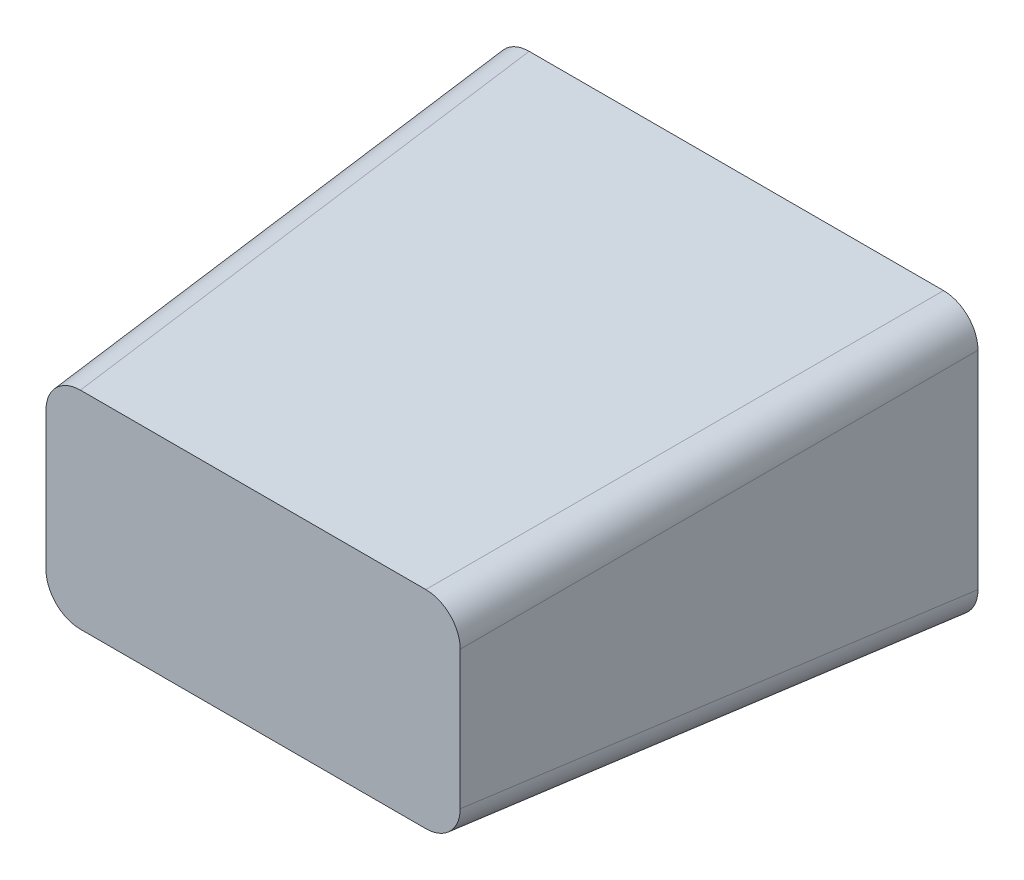
ISO-10303-21;
HEADER;
FILE_DESCRIPTION(('STEP AP214'),'2;1');
FILE_NAME('part.step','',(''),(''),'','','');
FILE_SCHEMA(('AUTOMOTIVE_DESIGN { 1 0 10303 214 1 1 1 1 }'));
ENDSEC;
DATA;
#1=APPLICATION_CONTEXT('core data for automotive mechanical design processes');
#2=APPLICATION_PROTOCOL_DEFINITION('international standard','automotive_design',2000,#1);
#3=PRODUCT_CONTEXT('',#1,'mechanical');
#4=PRODUCT('Part','Part','',(#3));
#5=PRODUCT_RELATED_PRODUCT_CATEGORY('part','',(#4));
#6=PRODUCT_DEFINITION_FORMATION('','',#4);
#7=PRODUCT_DEFINITION_CONTEXT('part definition',#1,'design');
#8=PRODUCT_DEFINITION('design','',#6,#7);
#9=PRODUCT_DEFINITION_SHAPE('','',#8);
#10=(LENGTH_UNIT() NAMED_UNIT(*) SI_UNIT(.MILLI.,.METRE.));
#11=(NAMED_UNIT(*) PLANE_ANGLE_UNIT() SI_UNIT($,.RADIAN.));
#12=(NAMED_UNIT(*) SI_UNIT($,.STERADIAN.) SOLID_ANGLE_UNIT());
#13=UNCERTAINTY_MEASURE_WITH_UNIT(LENGTH_MEASURE(1.E-05),#10,'distance_accuracy_value','');
#14=(GEOMETRIC_REPRESENTATION_CONTEXT(3) GLOBAL_UNCERTAINTY_ASSIGNED_CONTEXT((#13)) GLOBAL_UNIT_ASSIGNED_CONTEXT((#10,
#11,#12)) REPRESENTATION_CONTEXT('',''));
#15=CARTESIAN_POINT('',(0.,0.,0.));
#16=DIRECTION('',(0.,0.,1.));
#17=DIRECTION('',(1.,0.,0.));
#18=AXIS2_PLACEMENT_3D('',#15,#16,#17);
#19=CARTESIAN_POINT('',(-3.00532180265346,1.50532180265346,-0.0923396609575741));
#20=DIRECTION('',(0.0710669054518702,-0.0710669054518702,0.994936676326182));
#21=DIRECTION('',(0.997458699830735,0.,-0.0712470499879097));
#22=AXIS2_PLACEMENT_3D('',#19,#20,#21);
#23=CYLINDRICAL_SURFACE('',#22,0.499999999999999);
#24=CARTESIAN_POINT('',(-2.99872611258506,1.49872611258506,0.));
#25=DIRECTION('',(0.,0.,-1.));
#26=DIRECTION('',(0.707106781186548,-0.707106781186547,0.));
#27=AXIS2_PLACEMENT_3D('',#24,#25,#26);
#28=ELLIPSE('',#27,0.502544545695366,0.499999999999999);
#29=CARTESIAN_POINT('',(-3.00127065008464,2.,0.));
#30=VERTEX_POINT('',#29);
#31=CARTESIAN_POINT('',(-3.5,1.50127065008463,0.));
#32=VERTEX_POINT('',#31);
#33=EDGE_CURVE('E122',#30,#32,#28,.F.);
#34=ORIENTED_EDGE('',*,*,#33,.T.);
#35=DIRECTION('',(-0.0710669054518702,0.0710669054518704,-0.994936676326182));
#36=VECTOR('',#35,1.);
#37=CARTESIAN_POINT('',(-3.,1.00127065008463,6.99999999999999));
#38=LINE('',#37,#36);
#39=CARTESIAN_POINT('',(-2.99999999999999,1.00127065008463,6.99999999999999));
#40=VERTEX_POINT('',#39);
#41=EDGE_CURVE('E117',#40,#32,#38,.T.);
#42=ORIENTED_EDGE('',*,*,#41,.F.);
#43=CARTESIAN_POINT('',(-2.49872611258506,0.998726112585064,6.99999999999999));
#44=DIRECTION('',(0.,0.,1.));
#45=DIRECTION('',(0.707106781186548,-0.707106781186547,0.));
#46=AXIS2_PLACEMENT_3D('',#43,#44,#45);
#47=ELLIPSE('',#46,0.502544545695366,0.499999999999999);
#48=CARTESIAN_POINT('',(-2.50127065008463,1.5,6.99999999999999));
#49=VERTEX_POINT('',#48);
#50=EDGE_CURVE('E20',#40,#49,#47,.F.);
#51=ORIENTED_EDGE('',*,*,#50,.T.);
#52=DIRECTION('',(0.0710669054518715,-0.0710669054518702,0.994936676326182));
#53=VECTOR('',#52,1.);
#54=CARTESIAN_POINT('',(-3.00127065008464,2.,0.));
#55=LINE('',#54,#53);
#56=EDGE_CURVE('E120',#30,#49,#55,.T.);
#57=ORIENTED_EDGE('',*,*,#56,.F.);
#58=EDGE_LOOP('',(#34,#42,#51,#57));
#59=FACE_BOUND('',#58,.T.);
#60=ADVANCED_FACE('F17',(#59),#23,.T.);
#61=CARTESIAN_POINT('',(-3.5,2.,0.));
#62=DIRECTION('',(0.,0.997458699830735,0.0712470499879097));
#63=DIRECTION('',(0.,-0.0712470499879097,0.997458699830735));
#64=AXIS2_PLACEMENT_3D('',#61,#62,#63);
#65=PLANE('',#64);
#66=ORIENTED_EDGE('',*,*,#56,.T.);
#67=DIRECTION('',(1.,0.,0.));
#68=VECTOR('',#67,1.);
#69=CARTESIAN_POINT('',(0.,1.5,6.99999999999999));
#70=LINE('',#69,#68);
#71=CARTESIAN_POINT('',(2.50127065008464,1.5,6.99999999999999));
#72=VERTEX_POINT('',#71);
#73=EDGE_CURVE('E129',#72,#49,#70,.F.);
#74=ORIENTED_EDGE('',*,*,#73,.F.);
#75=DIRECTION('',(-0.0710669054518702,-0.0710669054518702,0.994936676326182));
#76=VECTOR('',#75,1.);
#77=CARTESIAN_POINT('',(2.98611271750846,1.98484206742381,0.212211056066591));
#78=LINE('',#77,#76);
#79=CARTESIAN_POINT('',(3.00127065008464,2.,0.));
#80=VERTEX_POINT('',#79);
#81=EDGE_CURVE('E69',#80,#72,#78,.T.);
#82=ORIENTED_EDGE('',*,*,#81,.F.);
#83=DIRECTION('',(-1.,0.,0.));
#84=VECTOR('',#83,1.);
#85=CARTESIAN_POINT('',(0.,2.,0.));
#86=LINE('',#85,#84);
#87=EDGE_CURVE('E132',#30,#80,#86,.F.);
#88=ORIENTED_EDGE('',*,*,#87,.F.);
#89=EDGE_LOOP('',(#66,#74,#82,#88));
#90=FACE_BOUND('',#89,.T.);
#91=ADVANCED_FACE('F159',(#90),#65,.T.);
#92=CARTESIAN_POINT('',(-3.5,-2.,0.));
#93=DIRECTION('',(-0.997458699830735,0.,0.0712470499879097));
#94=DIRECTION('',(0.0712470499879097,0.,0.997458699830735));
#95=AXIS2_PLACEMENT_3D('',#92,#93,#94);
#96=PLANE('',#95);
#97=ORIENTED_EDGE('',*,*,#41,.T.);
#98=DIRECTION('',(0.,1.,0.));
#99=VECTOR('',#98,1.);
#100=CARTESIAN_POINT('',(-3.5,0.,0.));
#101=LINE('',#100,#99);
#102=CARTESIAN_POINT('',(-3.49999999999999,-1.50127065008463,0.));
#103=VERTEX_POINT('',#102);
#104=EDGE_CURVE('E134',#103,#32,#101,.T.);
#105=ORIENTED_EDGE('',*,*,#104,.F.);
#106=DIRECTION('',(0.0710669054518702,0.0710669054518704,0.994936676326182));
#107=VECTOR('',#106,1.);
#108=CARTESIAN_POINT('',(-3.48484206742381,-1.48611271750845,0.21221105606659));
#109=LINE('',#108,#107);
#110=CARTESIAN_POINT('',(-2.99999999999999,-1.00127065008463,6.99999999999999));
#111=VERTEX_POINT('',#110);
#112=EDGE_CURVE('E115',#111,#103,#109,.F.);
#113=ORIENTED_EDGE('',*,*,#112,.F.);
#114=DIRECTION('',(0.,1.,0.));
#115=VECTOR('',#114,1.);
#116=CARTESIAN_POINT('',(-2.99999999999999,0.,6.99999999999999));
#117=LINE('',#116,#115);
#118=EDGE_CURVE('E101',#40,#111,#117,.F.);
#119=ORIENTED_EDGE('',*,*,#118,.F.);
#120=EDGE_LOOP('',(#97,#105,#113,#119));
#121=FACE_BOUND('',#120,.T.);
#122=ADVANCED_FACE('F140',(#121),#96,.T.);
#123=CARTESIAN_POINT('',(-3.00532180265346,-1.50532180265347,-0.0923396609575749));
#124=DIRECTION('',(0.0710669054518702,0.0710669054518704,0.994936676326182));
#125=DIRECTION('',(0.,-0.997458699830735,0.0712470499879099));
#126=AXIS2_PLACEMENT_3D('',#123,#124,#125);
#127=CYLINDRICAL_SURFACE('',#126,0.499999999999999);
#128=CARTESIAN_POINT('',(-2.99872611258506,-1.49872611258507,0.));
#129=DIRECTION('',(0.,0.,-1.));
#130=DIRECTION('',(0.707106781186547,0.707106781186548,0.));
#131=AXIS2_PLACEMENT_3D('',#128,#129,#130);
#132=ELLIPSE('',#131,0.502544545695366,0.499999999999999);
#133=CARTESIAN_POINT('',(-3.00127065008464,-2.,0.));
#134=VERTEX_POINT('',#133);
#135=EDGE_CURVE('E90',#134,#103,#132,.T.);
#136=ORIENTED_EDGE('',*,*,#135,.F.);
#137=DIRECTION('',(-0.0710669054518715,-0.0710669054518704,-0.994936676326182));
#138=VECTOR('',#137,1.);
#139=CARTESIAN_POINT('',(-2.50127065008463,-1.5,6.99999999999999));
#140=LINE('',#139,#138);
#141=CARTESIAN_POINT('',(-2.50127065008463,-1.5,6.99999999999999));
#142=VERTEX_POINT('',#141);
#143=EDGE_CURVE('E104',#142,#134,#140,.T.);
#144=ORIENTED_EDGE('',*,*,#143,.F.);
#145=CARTESIAN_POINT('',(-2.49872611258506,-0.998726112585066,6.99999999999999));
#146=DIRECTION('',(0.,0.,1.));
#147=DIRECTION('',(0.707106781186547,0.707106781186548,0.));
#148=AXIS2_PLACEMENT_3D('',#145,#146,#147);
#149=ELLIPSE('',#148,0.502544545695366,0.499999999999999);
#150=EDGE_CURVE('E95',#111,#142,#149,.T.);
#151=ORIENTED_EDGE('',*,*,#150,.F.);
#152=ORIENTED_EDGE('',*,*,#112,.T.);
#153=EDGE_LOOP('',(#136,#144,#151,#152));
#154=FACE_BOUND('',#153,.T.);
#155=ADVANCED_FACE('F105',(#154),#127,.T.);
#156=CARTESIAN_POINT('',(0.,0.,0.));
#157=DIRECTION('',(0.,0.,-1.));
#158=DIRECTION('',(-1.,0.,0.));
#159=AXIS2_PLACEMENT_3D('',#156,#157,#158);
#160=PLANE('',#159);
#161=CARTESIAN_POINT('',(2.99872611258506,1.49872611258507,0.));
#162=DIRECTION('',(0.,0.,-1.));
#163=DIRECTION('',(-0.707106781186547,-0.707106781186548,0.));
#164=AXIS2_PLACEMENT_3D('',#161,#162,#163);
#165=ELLIPSE('',#164,0.502544545695366,0.499999999999999);
#166=CARTESIAN_POINT('',(3.5,1.50127065008463,0.));
#167=VERTEX_POINT('',#166);
#168=EDGE_CURVE('E124',#167,#80,#165,.F.);
#169=ORIENTED_EDGE('',*,*,#168,.F.);
#170=DIRECTION('',(0.,1.,0.));
#171=VECTOR('',#170,1.);
#172=CARTESIAN_POINT('',(3.5,2.,0.));
#173=LINE('',#172,#171);
#174=CARTESIAN_POINT('',(3.5,-1.50127065008463,0.));
#175=VERTEX_POINT('',#174);
#176=EDGE_CURVE('E145',#175,#167,#173,.T.);
#177=ORIENTED_EDGE('',*,*,#176,.F.);
#178=CARTESIAN_POINT('',(2.99872611258506,-1.49872611258506,0.));
#179=DIRECTION('',(0.,0.,-1.));
#180=DIRECTION('',(-0.707106781186547,0.707106781186548,0.));
#181=AXIS2_PLACEMENT_3D('',#178,#179,#180);
#182=ELLIPSE('',#181,0.502544545695366,0.499999999999999);
#183=CARTESIAN_POINT('',(3.00127065008463,-2.,0.));
#184=VERTEX_POINT('',#183);
#185=EDGE_CURVE('E34',#175,#184,#182,.T.);
#186=ORIENTED_EDGE('',*,*,#185,.T.);
#187=DIRECTION('',(1.,0.,0.));
#188=VECTOR('',#187,1.);
#189=CARTESIAN_POINT('',(3.5,-2.,0.));
#190=LINE('',#189,#188);
#191=EDGE_CURVE('E108',#134,#184,#190,.T.);
#192=ORIENTED_EDGE('',*,*,#191,.F.);
#193=ORIENTED_EDGE('',*,*,#135,.T.);
#194=ORIENTED_EDGE('',*,*,#104,.T.);
#195=ORIENTED_EDGE('',*,*,#33,.F.);
#196=ORIENTED_EDGE('',*,*,#87,.T.);
#197=EDGE_LOOP('',(#169,#177,#186,#192,#193,#194,#195,#196));
#198=FACE_BOUND('',#197,.T.);
#199=ADVANCED_FACE('F141',(#198),#160,.T.);
#200=CARTESIAN_POINT('',(3.00532180265346,1.50532180265346,-0.0923396609575743));
#201=DIRECTION('',(-0.0710669054518702,-0.0710669054518702,0.994936676326182));
#202=DIRECTION('',(0.,-0.997458699830735,-0.0712470499879097));
#203=AXIS2_PLACEMENT_3D('',#200,#201,#202);
#204=CYLINDRICAL_SURFACE('',#203,0.499999999999999);
#205=ORIENTED_EDGE('',*,*,#168,.T.);
#206=ORIENTED_EDGE('',*,*,#81,.T.);
#207=CARTESIAN_POINT('',(2.49872611258506,0.998726112585065,6.99999999999999));
#208=DIRECTION('',(0.,0.,1.));
#209=DIRECTION('',(-0.707106781186547,-0.707106781186548,0.));
#210=AXIS2_PLACEMENT_3D('',#207,#208,#209);
#211=ELLIPSE('',#210,0.502544545695366,0.499999999999999);
#212=CARTESIAN_POINT('',(3.,1.00127065008463,6.99999999999999));
#213=VERTEX_POINT('',#212);
#214=EDGE_CURVE('E126',#213,#72,#211,.T.);
#215=ORIENTED_EDGE('',*,*,#214,.F.);
#216=DIRECTION('',(-0.0710669054518702,-0.0710669054518704,0.994936676326182));
#217=VECTOR('',#216,1.);
#218=CARTESIAN_POINT('',(3.5,1.50127065008463,0.));
#219=LINE('',#218,#217);
#220=EDGE_CURVE('E147',#167,#213,#219,.T.);
#221=ORIENTED_EDGE('',*,*,#220,.F.);
#222=EDGE_LOOP('',(#205,#206,#215,#221));
#223=FACE_BOUND('',#222,.T.);
#224=ADVANCED_FACE('F161',(#223),#204,.T.);
#225=CARTESIAN_POINT('',(0.,0.,6.99999999999999));
#226=DIRECTION('',(0.,0.,1.));
#227=DIRECTION('',(1.,0.,0.));
#228=AXIS2_PLACEMENT_3D('',#225,#226,#227);
#229=PLANE('',#228);
#230=ORIENTED_EDGE('',*,*,#150,.T.);
#231=DIRECTION('',(1.,0.,0.));
#232=VECTOR('',#231,1.);
#233=CARTESIAN_POINT('',(3.5,-1.5,6.99999999999999));
#234=LINE('',#233,#232);
#235=CARTESIAN_POINT('',(2.50127065008463,-1.5,6.99999999999999));
#236=VERTEX_POINT('',#235);
#237=EDGE_CURVE('E98',#236,#142,#234,.F.);
#238=ORIENTED_EDGE('',*,*,#237,.F.);
#239=CARTESIAN_POINT('',(2.49872611258506,-0.998726112585063,6.99999999999999));
#240=DIRECTION('',(0.,0.,1.));
#241=DIRECTION('',(-0.707106781186547,0.707106781186548,0.));
#242=AXIS2_PLACEMENT_3D('',#239,#240,#241);
#243=ELLIPSE('',#242,0.502544545695366,0.499999999999999);
#244=CARTESIAN_POINT('',(3.,-1.00127065008463,6.99999999999999));
#245=VERTEX_POINT('',#244);
#246=EDGE_CURVE('E123',#236,#245,#243,.T.);
#247=ORIENTED_EDGE('',*,*,#246,.T.);
#248=DIRECTION('',(0.,1.,0.));
#249=VECTOR('',#248,1.);
#250=CARTESIAN_POINT('',(3.,2.,6.99999999999999));
#251=LINE('',#250,#249);
#252=EDGE_CURVE('E151',#213,#245,#251,.F.);
#253=ORIENTED_EDGE('',*,*,#252,.F.);
#254=ORIENTED_EDGE('',*,*,#214,.T.);
#255=ORIENTED_EDGE('',*,*,#73,.T.);
#256=ORIENTED_EDGE('',*,*,#50,.F.);
#257=ORIENTED_EDGE('',*,*,#118,.T.);
#258=EDGE_LOOP('',(#230,#238,#247,#253,#254,#255,#256,#257));
#259=FACE_BOUND('',#258,.T.);
#260=ADVANCED_FACE('F96',(#259),#229,.T.);
#261=CARTESIAN_POINT('',(3.5,-2.,0.));
#262=DIRECTION('',(0.,-0.997458699830735,0.0712470499879099));
#263=DIRECTION('',(0.,-0.0712470499879099,-0.997458699830735));
#264=AXIS2_PLACEMENT_3D('',#261,#262,#263);
#265=PLANE('',#264);
#266=ORIENTED_EDGE('',*,*,#143,.T.);
#267=ORIENTED_EDGE('',*,*,#191,.T.);
#268=DIRECTION('',(-0.0710669054518703,0.0710669054518704,0.994936676326182));
#269=VECTOR('',#268,1.);
#270=CARTESIAN_POINT('',(2.99368847508421,-1.99241782499957,0.106150450005985));
#271=LINE('',#270,#269);
#272=EDGE_CURVE('E26',#236,#184,#271,.F.);
#273=ORIENTED_EDGE('',*,*,#272,.F.);
#274=ORIENTED_EDGE('',*,*,#237,.T.);
#275=EDGE_LOOP('',(#266,#267,#273,#274));
#276=FACE_BOUND('',#275,.T.);
#277=ADVANCED_FACE('F110',(#276),#265,.T.);
#278=CARTESIAN_POINT('',(3.5,2.,0.));
#279=DIRECTION('',(0.997458699830735,0.,0.0712470499879098));
#280=DIRECTION('',(0.0712470499879098,0.,-0.997458699830735));
#281=AXIS2_PLACEMENT_3D('',#278,#279,#280);
#282=PLANE('',#281);
#283=ORIENTED_EDGE('',*,*,#220,.T.);
#284=ORIENTED_EDGE('',*,*,#252,.T.);
#285=DIRECTION('',(-0.0710669054518703,0.0710669054518704,0.994936676326182));
#286=VECTOR('',#285,1.);
#287=CARTESIAN_POINT('',(3.49241782499957,-1.4936884750842,0.106150450005985));
#288=LINE('',#287,#286);
#289=EDGE_CURVE('E11',#175,#245,#288,.T.);
#290=ORIENTED_EDGE('',*,*,#289,.F.);
#291=ORIENTED_EDGE('',*,*,#176,.T.);
#292=EDGE_LOOP('',(#283,#284,#290,#291));
#293=FACE_BOUND('',#292,.T.);
#294=ADVANCED_FACE('F162',(#293),#282,.T.);
#295=CARTESIAN_POINT('',(3.00532180265346,-1.50532180265346,-0.0923396609575747));
#296=DIRECTION('',(-0.0710669054518703,0.0710669054518704,0.994936676326182));
#297=DIRECTION('',(0.,-0.997458699830735,0.0712470499879099));
#298=AXIS2_PLACEMENT_3D('',#295,#296,#297);
#299=CYLINDRICAL_SURFACE('',#298,0.499999999999999);
#300=ORIENTED_EDGE('',*,*,#185,.F.);
#301=ORIENTED_EDGE('',*,*,#289,.T.);
#302=ORIENTED_EDGE('',*,*,#246,.F.);
#303=ORIENTED_EDGE('',*,*,#272,.T.);
#304=EDGE_LOOP('',(#300,#301,#302,#303));
#305=FACE_BOUND('',#304,.T.);
#306=ADVANCED_FACE('F163',(#305),#299,.T.);
#307=CLOSED_SHELL('',(#60,#91,#122,#155,#199,#224,#260,#277,#294,#306));
#308=MANIFOLD_SOLID_BREP('B1',#307);
#309=ADVANCED_BREP_SHAPE_REPRESENTATION('',(#18,#308),#14);
#310=SHAPE_DEFINITION_REPRESENTATION(#9,#309);
ENDSEC;
END-ISO-10303-21;
